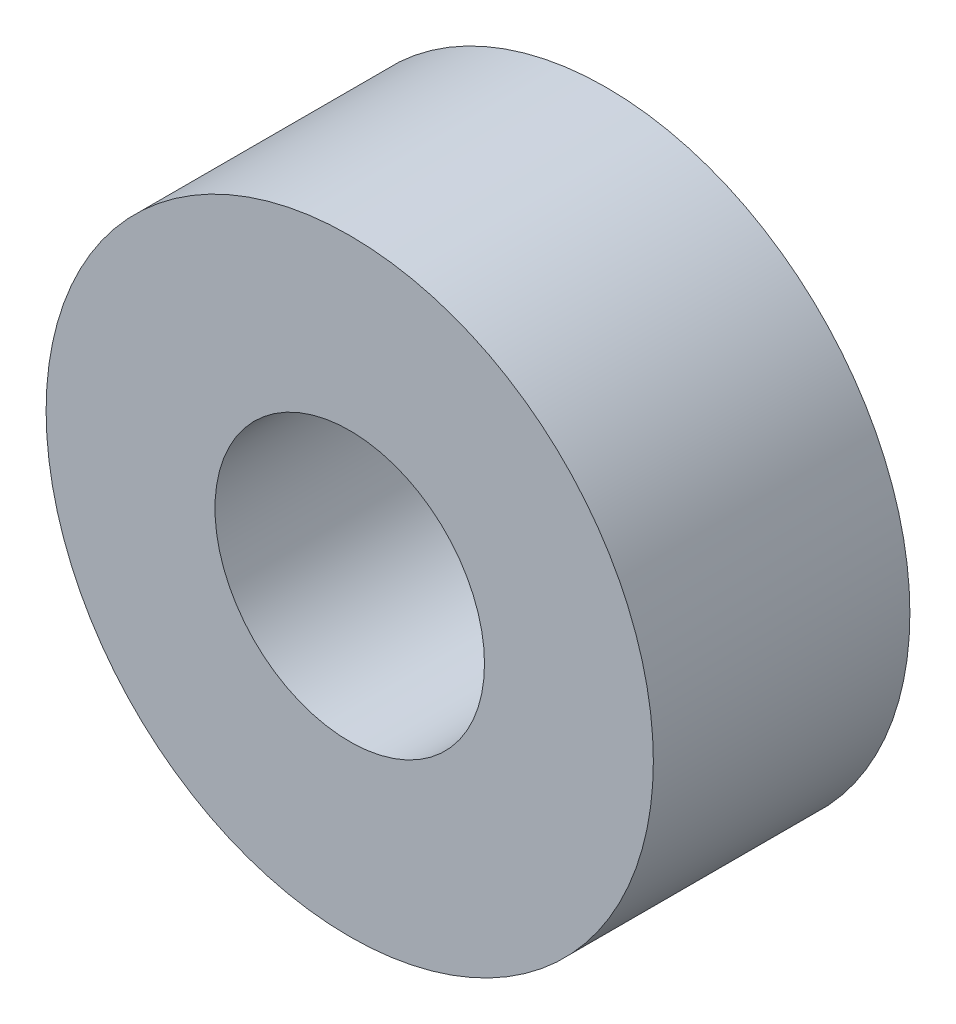
ISO-10303-21;
HEADER;
FILE_DESCRIPTION(('STEP AP214'),'2;1');
FILE_NAME('part.step','',(''),(''),'','','');
FILE_SCHEMA(('AUTOMOTIVE_DESIGN { 1 0 10303 214 1 1 1 1 }'));
ENDSEC;
DATA;
#1=APPLICATION_CONTEXT('core data for automotive mechanical design processes');
#2=APPLICATION_PROTOCOL_DEFINITION('international standard','automotive_design',2000,#1);
#3=PRODUCT_CONTEXT('',#1,'mechanical');
#4=PRODUCT('Part','Part','',(#3));
#5=PRODUCT_RELATED_PRODUCT_CATEGORY('part','',(#4));
#6=PRODUCT_DEFINITION_FORMATION('','',#4);
#7=PRODUCT_DEFINITION_CONTEXT('part definition',#1,'design');
#8=PRODUCT_DEFINITION('design','',#6,#7);
#9=PRODUCT_DEFINITION_SHAPE('','',#8);
#10=(LENGTH_UNIT() NAMED_UNIT(*) SI_UNIT(.MILLI.,.METRE.));
#11=(NAMED_UNIT(*) PLANE_ANGLE_UNIT() SI_UNIT($,.RADIAN.));
#12=(NAMED_UNIT(*) SI_UNIT($,.STERADIAN.) SOLID_ANGLE_UNIT());
#13=UNCERTAINTY_MEASURE_WITH_UNIT(LENGTH_MEASURE(1.E-05),#10,'distance_accuracy_value','');
#14=(GEOMETRIC_REPRESENTATION_CONTEXT(3) GLOBAL_UNCERTAINTY_ASSIGNED_CONTEXT((#13)) GLOBAL_UNIT_ASSIGNED_CONTEXT((#10,
#11,#12)) REPRESENTATION_CONTEXT('',''));
#15=CARTESIAN_POINT('',(0.,0.,0.));
#16=DIRECTION('',(0.,0.,1.));
#17=DIRECTION('',(1.,0.,0.));
#18=AXIS2_PLACEMENT_3D('',#15,#16,#17);
#19=CARTESIAN_POINT('',(0.,0.,7.9));
#20=DIRECTION('',(0.,0.,1.));
#21=DIRECTION('',(1.,0.,0.));
#22=AXIS2_PLACEMENT_3D('',#19,#20,#21);
#23=PLANE('',#22);
#24=CARTESIAN_POINT('',(0.,0.,7.9));
#25=DIRECTION('',(0.,0.,1.));
#26=DIRECTION('',(1.,0.,0.));
#27=AXIS2_PLACEMENT_3D('',#24,#25,#26);
#28=CIRCLE('',#27,9.35);
#29=CARTESIAN_POINT('',(9.35,0.,7.9));
#30=VERTEX_POINT('',#29);
#31=EDGE_CURVE('E10',#30,#30,#28,.T.);
#32=ORIENTED_EDGE('',*,*,#31,.T.);
#33=EDGE_LOOP('',(#32));
#34=FACE_BOUND('',#33,.T.);
#35=CARTESIAN_POINT('',(0.,0.,7.9));
#36=DIRECTION('',(0.,0.,1.));
#37=DIRECTION('',(1.,0.,0.));
#38=AXIS2_PLACEMENT_3D('',#35,#36,#37);
#39=CIRCLE('',#38,4.15);
#40=CARTESIAN_POINT('',(4.15,0.,7.9));
#41=VERTEX_POINT('',#40);
#42=EDGE_CURVE('E42',#41,#41,#39,.T.);
#43=ORIENTED_EDGE('',*,*,#42,.F.);
#44=EDGE_LOOP('',(#43));
#45=FACE_BOUND('',#44,.T.);
#46=ADVANCED_FACE('F31',(#34,#45),#23,.T.);
#47=CARTESIAN_POINT('',(0.,0.,0.));
#48=DIRECTION('',(0.,0.,1.));
#49=DIRECTION('',(1.,0.,0.));
#50=AXIS2_PLACEMENT_3D('',#47,#48,#49);
#51=PLANE('',#50);
#52=CARTESIAN_POINT('',(0.,0.,0.));
#53=DIRECTION('',(0.,0.,1.));
#54=DIRECTION('',(1.,0.,0.));
#55=AXIS2_PLACEMENT_3D('',#52,#53,#54);
#56=CIRCLE('',#55,9.35);
#57=CARTESIAN_POINT('',(9.35,0.,0.));
#58=VERTEX_POINT('',#57);
#59=EDGE_CURVE('E35',#58,#58,#56,.T.);
#60=ORIENTED_EDGE('',*,*,#59,.F.);
#61=EDGE_LOOP('',(#60));
#62=FACE_BOUND('',#61,.T.);
#63=CARTESIAN_POINT('',(0.,0.,0.));
#64=DIRECTION('',(0.,0.,1.));
#65=DIRECTION('',(1.,0.,0.));
#66=AXIS2_PLACEMENT_3D('',#63,#64,#65);
#67=CIRCLE('',#66,4.15);
#68=CARTESIAN_POINT('',(4.15,0.,0.));
#69=VERTEX_POINT('',#68);
#70=EDGE_CURVE('E44',#69,#69,#67,.T.);
#71=ORIENTED_EDGE('',*,*,#70,.T.);
#72=EDGE_LOOP('',(#71));
#73=FACE_BOUND('',#72,.T.);
#74=ADVANCED_FACE('F54',(#62,#73),#51,.F.);
#75=CARTESIAN_POINT('',(0.,0.,7.9));
#76=DIRECTION('',(0.,0.,-1.));
#77=DIRECTION('',(-1.,0.,0.));
#78=AXIS2_PLACEMENT_3D('',#75,#76,#77);
#79=CYLINDRICAL_SURFACE('',#78,9.35);
#80=ORIENTED_EDGE('',*,*,#31,.F.);
#81=EDGE_LOOP('',(#80));
#82=FACE_BOUND('',#81,.T.);
#83=ORIENTED_EDGE('',*,*,#59,.T.);
#84=EDGE_LOOP('',(#83));
#85=FACE_BOUND('',#84,.T.);
#86=ADVANCED_FACE('F33',(#82,#85),#79,.T.);
#87=CARTESIAN_POINT('',(0.,0.,7.9));
#88=DIRECTION('',(0.,0.,-1.));
#89=DIRECTION('',(-1.,0.,0.));
#90=AXIS2_PLACEMENT_3D('',#87,#88,#89);
#91=CYLINDRICAL_SURFACE('',#90,4.15);
#92=ORIENTED_EDGE('',*,*,#42,.T.);
#93=EDGE_LOOP('',(#92));
#94=FACE_BOUND('',#93,.T.);
#95=ORIENTED_EDGE('',*,*,#70,.F.);
#96=EDGE_LOOP('',(#95));
#97=FACE_BOUND('',#96,.T.);
#98=ADVANCED_FACE('F50',(#94,#97),#91,.F.);
#99=CLOSED_SHELL('',(#46,#74,#86,#98));
#100=MANIFOLD_SOLID_BREP('B2',#99);
#101=ADVANCED_BREP_SHAPE_REPRESENTATION('',(#18,#100),#14);
#102=SHAPE_DEFINITION_REPRESENTATION(#9,#101);
ENDSEC;
END-ISO-10303-21;
